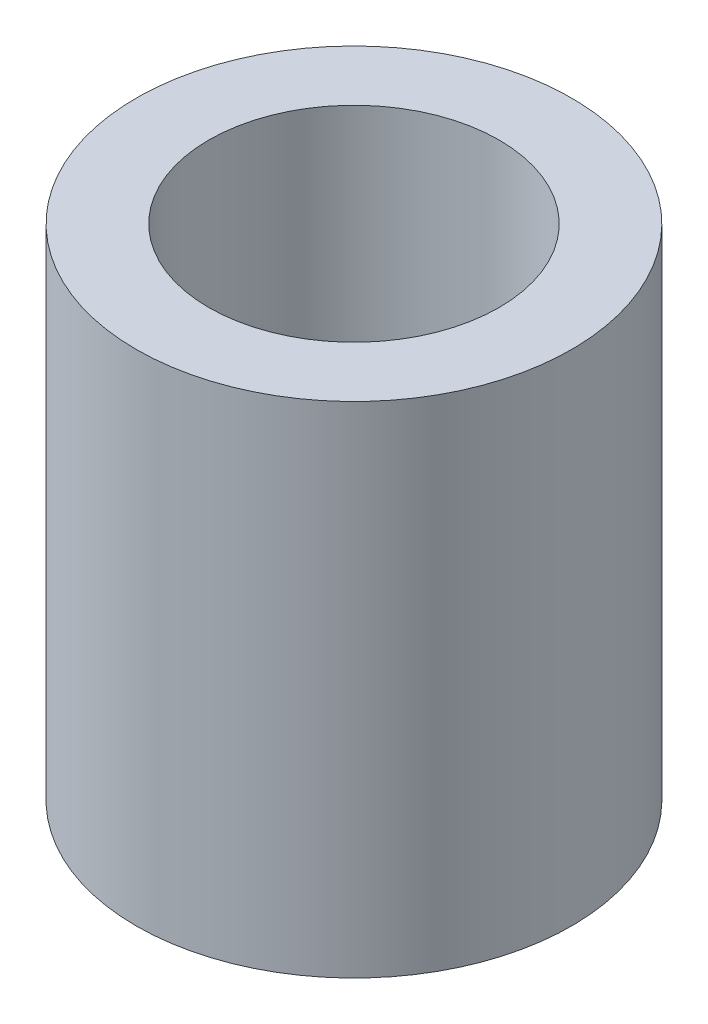
ISO-10303-21;
HEADER;
FILE_DESCRIPTION(('STEP AP214'),'2;1');
FILE_NAME('part.step','',(''),(''),'','','');
FILE_SCHEMA(('AUTOMOTIVE_DESIGN { 1 0 10303 214 1 1 1 1 }'));
ENDSEC;
DATA;
#1=APPLICATION_CONTEXT('core data for automotive mechanical design processes');
#2=APPLICATION_PROTOCOL_DEFINITION('international standard','automotive_design',2000,#1);
#3=PRODUCT_CONTEXT('',#1,'mechanical');
#4=PRODUCT('Part','Part','',(#3));
#5=PRODUCT_RELATED_PRODUCT_CATEGORY('part','',(#4));
#6=PRODUCT_DEFINITION_FORMATION('','',#4);
#7=PRODUCT_DEFINITION_CONTEXT('part definition',#1,'design');
#8=PRODUCT_DEFINITION('design','',#6,#7);
#9=PRODUCT_DEFINITION_SHAPE('','',#8);
#10=(LENGTH_UNIT() NAMED_UNIT(*) SI_UNIT(.MILLI.,.METRE.));
#11=(NAMED_UNIT(*) PLANE_ANGLE_UNIT() SI_UNIT($,.RADIAN.));
#12=(NAMED_UNIT(*) SI_UNIT($,.STERADIAN.) SOLID_ANGLE_UNIT());
#13=UNCERTAINTY_MEASURE_WITH_UNIT(LENGTH_MEASURE(1.E-05),#10,'distance_accuracy_value','');
#14=(GEOMETRIC_REPRESENTATION_CONTEXT(3) GLOBAL_UNCERTAINTY_ASSIGNED_CONTEXT((#13)) GLOBAL_UNIT_ASSIGNED_CONTEXT((#10,
#11,#12)) REPRESENTATION_CONTEXT('',''));
#15=CARTESIAN_POINT('',(0.,0.,0.));
#16=DIRECTION('',(0.,0.,1.));
#17=DIRECTION('',(1.,0.,0.));
#18=AXIS2_PLACEMENT_3D('',#15,#16,#17);
#19=CARTESIAN_POINT('',(-45.8832543055822,21.844,-24.5388290431753));
#20=DIRECTION('',(0.,1.,0.));
#21=DIRECTION('',(0.,0.,1.));
#22=AXIS2_PLACEMENT_3D('',#19,#20,#21);
#23=PLANE('',#22);
#24=CARTESIAN_POINT('',(-45.8832543055822,21.844,-24.5388290431753));
#25=DIRECTION('',(0.,1.,0.));
#26=DIRECTION('',(0.,0.,1.));
#27=AXIS2_PLACEMENT_3D('',#24,#25,#26);
#28=CIRCLE('',#27,9.525);
#29=CARTESIAN_POINT('',(-45.8832543055822,21.844,-15.0138290431753));
#30=VERTEX_POINT('',#29);
#31=EDGE_CURVE('E10',#30,#30,#28,.T.);
#32=ORIENTED_EDGE('',*,*,#31,.T.);
#33=EDGE_LOOP('',(#32));
#34=FACE_BOUND('',#33,.T.);
#35=CARTESIAN_POINT('',(-45.8832543055822,21.844,-24.5388290431753));
#36=DIRECTION('',(0.,1.,0.));
#37=DIRECTION('',(0.,0.,1.));
#38=AXIS2_PLACEMENT_3D('',#35,#36,#37);
#39=CIRCLE('',#38,6.35);
#40=CARTESIAN_POINT('',(-45.8832543055822,21.844,-18.1888290431753));
#41=VERTEX_POINT('',#40);
#42=EDGE_CURVE('E43',#41,#41,#39,.T.);
#43=ORIENTED_EDGE('',*,*,#42,.F.);
#44=EDGE_LOOP('',(#43));
#45=FACE_BOUND('',#44,.T.);
#46=ADVANCED_FACE('F32',(#34,#45),#23,.T.);
#47=CARTESIAN_POINT('',(-45.8832543055822,0.,-24.5388290431753));
#48=DIRECTION('',(0.,1.,0.));
#49=DIRECTION('',(0.,0.,1.));
#50=AXIS2_PLACEMENT_3D('',#47,#48,#49);
#51=PLANE('',#50);
#52=CARTESIAN_POINT('',(-45.8832543055822,0.,-24.5388290431753));
#53=DIRECTION('',(0.,1.,0.));
#54=DIRECTION('',(0.,0.,1.));
#55=AXIS2_PLACEMENT_3D('',#52,#53,#54);
#56=CIRCLE('',#55,9.525);
#57=CARTESIAN_POINT('',(-45.8832543055822,0.,-15.0138290431753));
#58=VERTEX_POINT('',#57);
#59=EDGE_CURVE('E36',#58,#58,#56,.T.);
#60=ORIENTED_EDGE('',*,*,#59,.F.);
#61=EDGE_LOOP('',(#60));
#62=FACE_BOUND('',#61,.T.);
#63=CARTESIAN_POINT('',(-45.8832543055822,0.,-24.5388290431753));
#64=DIRECTION('',(0.,1.,0.));
#65=DIRECTION('',(0.,0.,1.));
#66=AXIS2_PLACEMENT_3D('',#63,#64,#65);
#67=CIRCLE('',#66,6.35);
#68=CARTESIAN_POINT('',(-45.8832543055822,0.,-18.1888290431753));
#69=VERTEX_POINT('',#68);
#70=EDGE_CURVE('E45',#69,#69,#67,.T.);
#71=ORIENTED_EDGE('',*,*,#70,.T.);
#72=EDGE_LOOP('',(#71));
#73=FACE_BOUND('',#72,.T.);
#74=ADVANCED_FACE('F55',(#62,#73),#51,.F.);
#75=CARTESIAN_POINT('',(-45.8832543055822,21.844,-24.5388290431753));
#76=DIRECTION('',(0.,-1.,0.));
#77=DIRECTION('',(0.,0.,-1.));
#78=AXIS2_PLACEMENT_3D('',#75,#76,#77);
#79=CYLINDRICAL_SURFACE('',#78,9.525);
#80=ORIENTED_EDGE('',*,*,#31,.F.);
#81=EDGE_LOOP('',(#80));
#82=FACE_BOUND('',#81,.T.);
#83=ORIENTED_EDGE('',*,*,#59,.T.);
#84=EDGE_LOOP('',(#83));
#85=FACE_BOUND('',#84,.T.);
#86=ADVANCED_FACE('F34',(#82,#85),#79,.T.);
#87=CARTESIAN_POINT('',(-45.8832543055822,21.844,-24.5388290431753));
#88=DIRECTION('',(0.,-1.,0.));
#89=DIRECTION('',(0.,0.,-1.));
#90=AXIS2_PLACEMENT_3D('',#87,#88,#89);
#91=CYLINDRICAL_SURFACE('',#90,6.35);
#92=ORIENTED_EDGE('',*,*,#42,.T.);
#93=EDGE_LOOP('',(#92));
#94=FACE_BOUND('',#93,.T.);
#95=ORIENTED_EDGE('',*,*,#70,.F.);
#96=EDGE_LOOP('',(#95));
#97=FACE_BOUND('',#96,.T.);
#98=ADVANCED_FACE('F51',(#94,#97),#91,.F.);
#99=CLOSED_SHELL('',(#46,#74,#86,#98));
#100=MANIFOLD_SOLID_BREP('B2',#99);
#101=ADVANCED_BREP_SHAPE_REPRESENTATION('',(#18,#100),#14);
#102=SHAPE_DEFINITION_REPRESENTATION(#9,#101);
ENDSEC;
END-ISO-10303-21;
